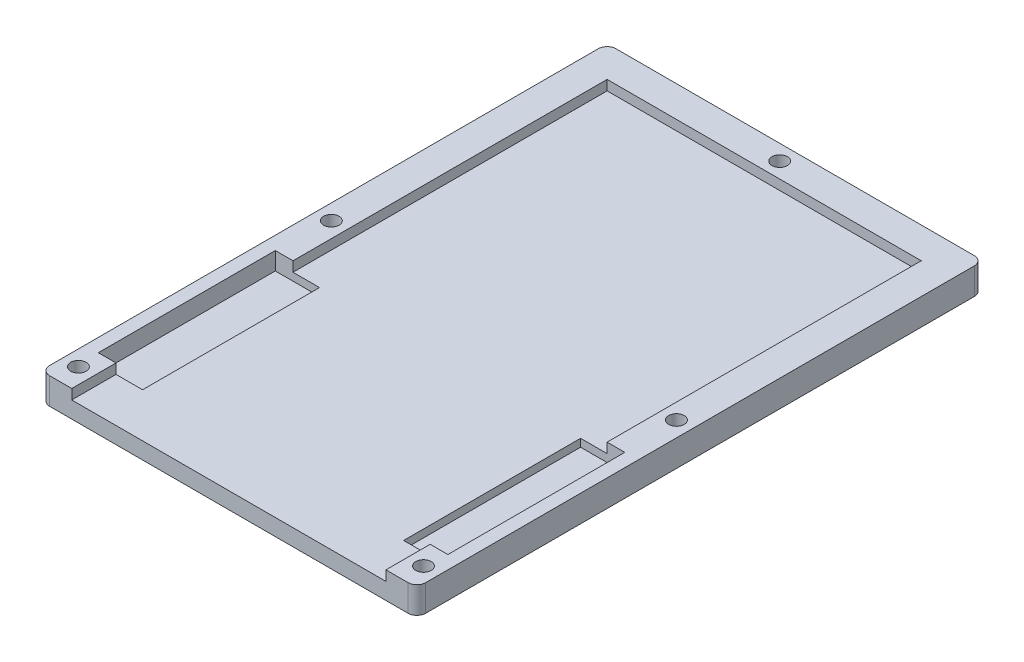
ISO-10303-21;
HEADER;
FILE_DESCRIPTION(('STEP AP214'),'2;1');
FILE_NAME('part.step','',(''),(''),'','','');
FILE_SCHEMA(('AUTOMOTIVE_DESIGN { 1 0 10303 214 1 1 1 1 }'));
ENDSEC;
DATA;
#1=APPLICATION_CONTEXT('core data for automotive mechanical design processes');
#2=APPLICATION_PROTOCOL_DEFINITION('international standard','automotive_design',2000,#1);
#3=PRODUCT_CONTEXT('',#1,'mechanical');
#4=PRODUCT('Part','Part','',(#3));
#5=PRODUCT_RELATED_PRODUCT_CATEGORY('part','',(#4));
#6=PRODUCT_DEFINITION_FORMATION('','',#4);
#7=PRODUCT_DEFINITION_CONTEXT('part definition',#1,'design');
#8=PRODUCT_DEFINITION('design','',#6,#7);
#9=PRODUCT_DEFINITION_SHAPE('','',#8);
#10=(LENGTH_UNIT() NAMED_UNIT(*) SI_UNIT(.MILLI.,.METRE.));
#11=(NAMED_UNIT(*) PLANE_ANGLE_UNIT() SI_UNIT($,.RADIAN.));
#12=(NAMED_UNIT(*) SI_UNIT($,.STERADIAN.) SOLID_ANGLE_UNIT());
#13=UNCERTAINTY_MEASURE_WITH_UNIT(LENGTH_MEASURE(1.E-05),#10,'distance_accuracy_value','');
#14=(GEOMETRIC_REPRESENTATION_CONTEXT(3) GLOBAL_UNCERTAINTY_ASSIGNED_CONTEXT((#13)) GLOBAL_UNIT_ASSIGNED_CONTEXT((#10,
#11,#12)) REPRESENTATION_CONTEXT('',''));
#15=CARTESIAN_POINT('',(0.,0.,0.));
#16=DIRECTION('',(0.,0.,1.));
#17=DIRECTION('',(1.,0.,0.));
#18=AXIS2_PLACEMENT_3D('',#15,#16,#17);
#19=CARTESIAN_POINT('',(-40.5,6.,62.));
#20=DIRECTION('',(0.,1.,0.));
#21=DIRECTION('',(0.,0.,1.));
#22=AXIS2_PLACEMENT_3D('',#19,#20,#21);
#23=CYLINDRICAL_SURFACE('',#22,2.);
#24=DIRECTION('',(0.,1.,0.));
#25=VECTOR('',#24,1.);
#26=CARTESIAN_POINT('',(-42.5,6.,62.));
#27=LINE('',#26,#25);
#28=CARTESIAN_POINT('',(-42.5,0.,62.));
#29=VERTEX_POINT('',#28);
#30=CARTESIAN_POINT('',(-42.5,6.,62.));
#31=VERTEX_POINT('',#30);
#32=EDGE_CURVE('E425',#29,#31,#27,.T.);
#33=ORIENTED_EDGE('',*,*,#32,.F.);
#34=CARTESIAN_POINT('',(-40.5,0.,62.));
#35=DIRECTION('',(0.,1.,0.));
#36=DIRECTION('',(0.,0.,1.));
#37=AXIS2_PLACEMENT_3D('',#34,#35,#36);
#38=CIRCLE('',#37,2.);
#39=CARTESIAN_POINT('',(-40.5,0.,64.));
#40=VERTEX_POINT('',#39);
#41=EDGE_CURVE('E42',#40,#29,#38,.F.);
#42=ORIENTED_EDGE('',*,*,#41,.F.);
#43=DIRECTION('',(0.,1.,0.));
#44=VECTOR('',#43,1.);
#45=CARTESIAN_POINT('',(-40.5,6.,64.));
#46=LINE('',#45,#44);
#47=CARTESIAN_POINT('',(-40.5,6.,64.));
#48=VERTEX_POINT('',#47);
#49=EDGE_CURVE('E428',#48,#40,#46,.F.);
#50=ORIENTED_EDGE('',*,*,#49,.F.);
#51=CARTESIAN_POINT('',(-40.5,6.,62.));
#52=DIRECTION('',(0.,1.,0.));
#53=DIRECTION('',(0.,0.,1.));
#54=AXIS2_PLACEMENT_3D('',#51,#52,#53);
#55=CIRCLE('',#54,2.);
#56=EDGE_CURVE('E11',#31,#48,#55,.T.);
#57=ORIENTED_EDGE('',*,*,#56,.F.);
#58=EDGE_LOOP('',(#33,#42,#50,#57));
#59=FACE_BOUND('',#58,.T.);
#60=ADVANCED_FACE('F35',(#59),#23,.T.);
#61=CARTESIAN_POINT('',(-40.5,6.,-62.));
#62=DIRECTION('',(0.,1.,0.));
#63=DIRECTION('',(0.,0.,1.));
#64=AXIS2_PLACEMENT_3D('',#61,#62,#63);
#65=CYLINDRICAL_SURFACE('',#64,2.);
#66=DIRECTION('',(0.,1.,0.));
#67=VECTOR('',#66,1.);
#68=CARTESIAN_POINT('',(-40.5,6.,-64.));
#69=LINE('',#68,#67);
#70=CARTESIAN_POINT('',(-40.5,0.,-64.));
#71=VERTEX_POINT('',#70);
#72=CARTESIAN_POINT('',(-40.5,6.,-64.));
#73=VERTEX_POINT('',#72);
#74=EDGE_CURVE('E415',#71,#73,#69,.T.);
#75=ORIENTED_EDGE('',*,*,#74,.F.);
#76=CARTESIAN_POINT('',(-40.5,0.,-62.));
#77=DIRECTION('',(0.,1.,0.));
#78=DIRECTION('',(0.,0.,1.));
#79=AXIS2_PLACEMENT_3D('',#76,#77,#78);
#80=CIRCLE('',#79,2.);
#81=CARTESIAN_POINT('',(-42.5,0.,-62.));
#82=VERTEX_POINT('',#81);
#83=EDGE_CURVE('E421',#82,#71,#80,.F.);
#84=ORIENTED_EDGE('',*,*,#83,.F.);
#85=DIRECTION('',(0.,1.,0.));
#86=VECTOR('',#85,1.);
#87=CARTESIAN_POINT('',(-42.5,6.,-62.));
#88=LINE('',#87,#86);
#89=CARTESIAN_POINT('',(-42.5,6.,-62.));
#90=VERTEX_POINT('',#89);
#91=EDGE_CURVE('E418',#90,#82,#88,.F.);
#92=ORIENTED_EDGE('',*,*,#91,.F.);
#93=CARTESIAN_POINT('',(-40.5,6.,-62.));
#94=DIRECTION('',(0.,1.,0.));
#95=DIRECTION('',(0.,0.,1.));
#96=AXIS2_PLACEMENT_3D('',#93,#94,#95);
#97=CIRCLE('',#96,2.);
#98=EDGE_CURVE('E423',#73,#90,#97,.T.);
#99=ORIENTED_EDGE('',*,*,#98,.F.);
#100=EDGE_LOOP('',(#75,#84,#92,#99));
#101=FACE_BOUND('',#100,.T.);
#102=ADVANCED_FACE('F439',(#101),#65,.T.);
#103=CARTESIAN_POINT('',(40.5,6.,-62.));
#104=DIRECTION('',(0.,1.,0.));
#105=DIRECTION('',(0.,0.,1.));
#106=AXIS2_PLACEMENT_3D('',#103,#104,#105);
#107=CYLINDRICAL_SURFACE('',#106,2.);
#108=DIRECTION('',(0.,1.,0.));
#109=VECTOR('',#108,1.);
#110=CARTESIAN_POINT('',(42.5,6.,-62.));
#111=LINE('',#110,#109);
#112=CARTESIAN_POINT('',(42.5,0.,-62.));
#113=VERTEX_POINT('',#112);
#114=CARTESIAN_POINT('',(42.5,6.,-62.));
#115=VERTEX_POINT('',#114);
#116=EDGE_CURVE('E405',#113,#115,#111,.T.);
#117=ORIENTED_EDGE('',*,*,#116,.F.);
#118=CARTESIAN_POINT('',(40.5,0.,-62.));
#119=DIRECTION('',(0.,1.,0.));
#120=DIRECTION('',(0.,0.,1.));
#121=AXIS2_PLACEMENT_3D('',#118,#119,#120);
#122=CIRCLE('',#121,2.);
#123=CARTESIAN_POINT('',(40.5,0.,-64.));
#124=VERTEX_POINT('',#123);
#125=EDGE_CURVE('E411',#124,#113,#122,.F.);
#126=ORIENTED_EDGE('',*,*,#125,.F.);
#127=DIRECTION('',(0.,1.,0.));
#128=VECTOR('',#127,1.);
#129=CARTESIAN_POINT('',(40.5,6.,-64.));
#130=LINE('',#129,#128);
#131=CARTESIAN_POINT('',(40.5,6.,-64.));
#132=VERTEX_POINT('',#131);
#133=EDGE_CURVE('E408',#132,#124,#130,.F.);
#134=ORIENTED_EDGE('',*,*,#133,.F.);
#135=CARTESIAN_POINT('',(40.5,6.,-62.));
#136=DIRECTION('',(0.,1.,0.));
#137=DIRECTION('',(0.,0.,1.));
#138=AXIS2_PLACEMENT_3D('',#135,#136,#137);
#139=CIRCLE('',#138,2.);
#140=EDGE_CURVE('E413',#115,#132,#139,.T.);
#141=ORIENTED_EDGE('',*,*,#140,.F.);
#142=EDGE_LOOP('',(#117,#126,#134,#141));
#143=FACE_BOUND('',#142,.T.);
#144=ADVANCED_FACE('F448',(#143),#107,.T.);
#145=CARTESIAN_POINT('',(40.5,6.,62.));
#146=DIRECTION('',(0.,1.,0.));
#147=DIRECTION('',(0.,0.,1.));
#148=AXIS2_PLACEMENT_3D('',#145,#146,#147);
#149=CYLINDRICAL_SURFACE('',#148,2.);
#150=DIRECTION('',(0.,1.,0.));
#151=VECTOR('',#150,1.);
#152=CARTESIAN_POINT('',(40.5,6.,64.));
#153=LINE('',#152,#151);
#154=CARTESIAN_POINT('',(40.5,0.,64.));
#155=VERTEX_POINT('',#154);
#156=CARTESIAN_POINT('',(40.5,6.,64.));
#157=VERTEX_POINT('',#156);
#158=EDGE_CURVE('E394',#155,#157,#153,.T.);
#159=ORIENTED_EDGE('',*,*,#158,.F.);
#160=CARTESIAN_POINT('',(40.5,0.,62.));
#161=DIRECTION('',(0.,1.,0.));
#162=DIRECTION('',(0.,0.,1.));
#163=AXIS2_PLACEMENT_3D('',#160,#161,#162);
#164=CIRCLE('',#163,2.);
#165=CARTESIAN_POINT('',(42.5,0.,62.));
#166=VERTEX_POINT('',#165);
#167=EDGE_CURVE('E400',#166,#155,#164,.F.);
#168=ORIENTED_EDGE('',*,*,#167,.F.);
#169=DIRECTION('',(0.,1.,0.));
#170=VECTOR('',#169,1.);
#171=CARTESIAN_POINT('',(42.5,6.,62.));
#172=LINE('',#171,#170);
#173=CARTESIAN_POINT('',(42.5,6.,62.));
#174=VERTEX_POINT('',#173);
#175=EDGE_CURVE('E397',#174,#166,#172,.F.);
#176=ORIENTED_EDGE('',*,*,#175,.F.);
#177=CARTESIAN_POINT('',(40.5,6.,62.));
#178=DIRECTION('',(0.,1.,0.));
#179=DIRECTION('',(0.,0.,1.));
#180=AXIS2_PLACEMENT_3D('',#177,#178,#179);
#181=CIRCLE('',#180,2.);
#182=EDGE_CURVE('E403',#157,#174,#181,.T.);
#183=ORIENTED_EDGE('',*,*,#182,.F.);
#184=EDGE_LOOP('',(#159,#168,#176,#183));
#185=FACE_BOUND('',#184,.T.);
#186=ADVANCED_FACE('F455',(#185),#149,.T.);
#187=CARTESIAN_POINT('',(-35.5,3.75,64.));
#188=DIRECTION('',(-1.,0.,0.));
#189=DIRECTION('',(0.,0.,1.));
#190=AXIS2_PLACEMENT_3D('',#187,#188,#189);
#191=PLANE('',#190);
#192=DIRECTION('',(0.,0.,1.));
#193=VECTOR('',#192,1.);
#194=CARTESIAN_POINT('',(-35.5,6.,64.));
#195=LINE('',#194,#193);
#196=CARTESIAN_POINT('',(-35.5,6.,-57.));
#197=VERTEX_POINT('',#196);
#198=CARTESIAN_POINT('',(-35.5,6.,14.));
#199=VERTEX_POINT('',#198);
#200=EDGE_CURVE('E290',#197,#199,#195,.T.);
#201=ORIENTED_EDGE('',*,*,#200,.T.);
#202=DIRECTION('',(0.,-1.,0.));
#203=VECTOR('',#202,1.);
#204=CARTESIAN_POINT('',(-35.5,3.75,14.));
#205=LINE('',#204,#203);
#206=CARTESIAN_POINT('',(-35.5,3.75,14.));
#207=VERTEX_POINT('',#206);
#208=EDGE_CURVE('E235',#199,#207,#205,.T.);
#209=ORIENTED_EDGE('',*,*,#208,.T.);
#210=DIRECTION('',(0.,0.,1.));
#211=VECTOR('',#210,1.);
#212=CARTESIAN_POINT('',(-35.5,3.75,64.));
#213=LINE('',#212,#211);
#214=CARTESIAN_POINT('',(-35.5,3.75,-57.));
#215=VERTEX_POINT('',#214);
#216=EDGE_CURVE('E275',#215,#207,#213,.T.);
#217=ORIENTED_EDGE('',*,*,#216,.F.);
#218=DIRECTION('',(0.,1.,0.));
#219=VECTOR('',#218,1.);
#220=CARTESIAN_POINT('',(-35.5,3.75,-57.));
#221=LINE('',#220,#219);
#222=EDGE_CURVE('E300',#215,#197,#221,.T.);
#223=ORIENTED_EDGE('',*,*,#222,.T.);
#224=EDGE_LOOP('',(#201,#209,#217,#223));
#225=FACE_BOUND('',#224,.T.);
#226=ADVANCED_FACE('F485',(#225),#191,.F.);
#227=CARTESIAN_POINT('',(35.5,3.75,64.));
#228=DIRECTION('',(1.,0.,0.));
#229=DIRECTION('',(0.,0.,-1.));
#230=AXIS2_PLACEMENT_3D('',#227,#228,#229);
#231=PLANE('',#230);
#232=DIRECTION('',(0.,0.,-1.));
#233=VECTOR('',#232,1.);
#234=CARTESIAN_POINT('',(35.5,6.,64.));
#235=LINE('',#234,#233);
#236=CARTESIAN_POINT('',(35.5,6.,64.));
#237=VERTEX_POINT('',#236);
#238=CARTESIAN_POINT('',(35.5,6.,54.));
#239=VERTEX_POINT('',#238);
#240=EDGE_CURVE('E294',#237,#239,#235,.T.);
#241=ORIENTED_EDGE('',*,*,#240,.T.);
#242=DIRECTION('',(0.,-1.,0.));
#243=VECTOR('',#242,1.);
#244=CARTESIAN_POINT('',(35.5,3.75,54.));
#245=LINE('',#244,#243);
#246=CARTESIAN_POINT('',(35.5,3.75,54.));
#247=VERTEX_POINT('',#246);
#248=EDGE_CURVE('E271',#239,#247,#245,.T.);
#249=ORIENTED_EDGE('',*,*,#248,.T.);
#250=DIRECTION('',(0.,0.,-1.));
#251=VECTOR('',#250,1.);
#252=CARTESIAN_POINT('',(35.5,3.75,64.));
#253=LINE('',#252,#251);
#254=CARTESIAN_POINT('',(35.5,3.75,64.));
#255=VERTEX_POINT('',#254);
#256=EDGE_CURVE('E283',#255,#247,#253,.T.);
#257=ORIENTED_EDGE('',*,*,#256,.F.);
#258=DIRECTION('',(0.,1.,0.));
#259=VECTOR('',#258,1.);
#260=CARTESIAN_POINT('',(35.5,3.75,64.));
#261=LINE('',#260,#259);
#262=EDGE_CURVE('E306',#255,#237,#261,.T.);
#263=ORIENTED_EDGE('',*,*,#262,.T.);
#264=EDGE_LOOP('',(#241,#249,#257,#263));
#265=FACE_BOUND('',#264,.T.);
#266=ADVANCED_FACE('F468',(#265),#231,.F.);
#267=CARTESIAN_POINT('',(-42.5,6.,64.));
#268=DIRECTION('',(1.,0.,0.));
#269=DIRECTION('',(0.,0.,-1.));
#270=AXIS2_PLACEMENT_3D('',#267,#268,#269);
#271=PLANE('',#270);
#272=DIRECTION('',(0.,0.,1.));
#273=VECTOR('',#272,1.);
#274=CARTESIAN_POINT('',(-42.5,0.,64.));
#275=LINE('',#274,#273);
#276=EDGE_CURVE('E344',#82,#29,#275,.T.);
#277=ORIENTED_EDGE('',*,*,#276,.T.);
#278=ORIENTED_EDGE('',*,*,#32,.T.);
#279=DIRECTION('',(0.,0.,1.));
#280=VECTOR('',#279,1.);
#281=CARTESIAN_POINT('',(-42.5,6.,64.));
#282=LINE('',#281,#280);
#283=EDGE_CURVE('E345',#90,#31,#282,.T.);
#284=ORIENTED_EDGE('',*,*,#283,.F.);
#285=ORIENTED_EDGE('',*,*,#91,.T.);
#286=EDGE_LOOP('',(#277,#278,#284,#285));
#287=FACE_BOUND('',#286,.T.);
#288=ADVANCED_FACE('F435',(#287),#271,.F.);
#289=CARTESIAN_POINT('',(42.5,6.,64.));
#290=DIRECTION('',(0.,0.,-1.));
#291=DIRECTION('',(-1.,0.,0.));
#292=AXIS2_PLACEMENT_3D('',#289,#290,#291);
#293=PLANE('',#292);
#294=DIRECTION('',(1.,0.,0.));
#295=VECTOR('',#294,1.);
#296=CARTESIAN_POINT('',(42.5,6.,64.));
#297=LINE('',#296,#295);
#298=CARTESIAN_POINT('',(-35.5,6.,64.));
#299=VERTEX_POINT('',#298);
#300=EDGE_CURVE('E349',#48,#299,#297,.T.);
#301=ORIENTED_EDGE('',*,*,#300,.F.);
#302=ORIENTED_EDGE('',*,*,#49,.T.);
#303=DIRECTION('',(1.,0.,0.));
#304=VECTOR('',#303,1.);
#305=CARTESIAN_POINT('',(42.5,0.,64.));
#306=LINE('',#305,#304);
#307=EDGE_CURVE('E360',#40,#155,#306,.T.);
#308=ORIENTED_EDGE('',*,*,#307,.T.);
#309=ORIENTED_EDGE('',*,*,#158,.T.);
#310=EDGE_CURVE('E347',#237,#157,#297,.T.);
#311=ORIENTED_EDGE('',*,*,#310,.F.);
#312=ORIENTED_EDGE('',*,*,#262,.F.);
#313=DIRECTION('',(1.,0.,0.));
#314=VECTOR('',#313,1.);
#315=CARTESIAN_POINT('',(-35.5,3.75,64.));
#316=LINE('',#315,#314);
#317=CARTESIAN_POINT('',(-35.5,3.75,64.));
#318=VERTEX_POINT('',#317);
#319=EDGE_CURVE('E278',#318,#255,#316,.T.);
#320=ORIENTED_EDGE('',*,*,#319,.F.);
#321=DIRECTION('',(0.,1.,0.));
#322=VECTOR('',#321,1.);
#323=CARTESIAN_POINT('',(-35.5,3.75,64.));
#324=LINE('',#323,#322);
#325=EDGE_CURVE('E289',#318,#299,#324,.T.);
#326=ORIENTED_EDGE('',*,*,#325,.T.);
#327=EDGE_LOOP('',(#301,#302,#308,#309,#311,#312,#320,#326));
#328=FACE_BOUND('',#327,.T.);
#329=ADVANCED_FACE('F460',(#328),#293,.F.);
#330=CARTESIAN_POINT('',(42.5,6.,64.));
#331=DIRECTION('',(-1.,0.,0.));
#332=DIRECTION('',(0.,0.,1.));
#333=AXIS2_PLACEMENT_3D('',#330,#331,#332);
#334=PLANE('',#333);
#335=DIRECTION('',(0.,0.,-1.));
#336=VECTOR('',#335,1.);
#337=CARTESIAN_POINT('',(42.5,0.,64.));
#338=LINE('',#337,#336);
#339=EDGE_CURVE('E362',#166,#113,#338,.T.);
#340=ORIENTED_EDGE('',*,*,#339,.T.);
#341=ORIENTED_EDGE('',*,*,#116,.T.);
#342=DIRECTION('',(0.,0.,-1.));
#343=VECTOR('',#342,1.);
#344=CARTESIAN_POINT('',(42.5,6.,64.));
#345=LINE('',#344,#343);
#346=EDGE_CURVE('E351',#174,#115,#345,.T.);
#347=ORIENTED_EDGE('',*,*,#346,.F.);
#348=ORIENTED_EDGE('',*,*,#175,.T.);
#349=EDGE_LOOP('',(#340,#341,#347,#348));
#350=FACE_BOUND('',#349,.T.);
#351=ADVANCED_FACE('F451',(#350),#334,.F.);
#352=CARTESIAN_POINT('',(42.5,6.,-64.));
#353=DIRECTION('',(0.,0.,1.));
#354=DIRECTION('',(1.,0.,0.));
#355=AXIS2_PLACEMENT_3D('',#352,#353,#354);
#356=PLANE('',#355);
#357=DIRECTION('',(-1.,0.,0.));
#358=VECTOR('',#357,1.);
#359=CARTESIAN_POINT('',(42.5,0.,-64.));
#360=LINE('',#359,#358);
#361=EDGE_CURVE('E348',#124,#71,#360,.T.);
#362=ORIENTED_EDGE('',*,*,#361,.T.);
#363=ORIENTED_EDGE('',*,*,#74,.T.);
#364=DIRECTION('',(-1.,0.,0.));
#365=VECTOR('',#364,1.);
#366=CARTESIAN_POINT('',(42.5,6.,-64.));
#367=LINE('',#366,#365);
#368=EDGE_CURVE('E354',#132,#73,#367,.T.);
#369=ORIENTED_EDGE('',*,*,#368,.F.);
#370=ORIENTED_EDGE('',*,*,#133,.T.);
#371=EDGE_LOOP('',(#362,#363,#369,#370));
#372=FACE_BOUND('',#371,.T.);
#373=ADVANCED_FACE('F444',(#372),#356,.F.);
#374=CARTESIAN_POINT('',(0.,6.,0.));
#375=DIRECTION('',(0.,1.,0.));
#376=DIRECTION('',(0.,0.,1.));
#377=AXIS2_PLACEMENT_3D('',#374,#375,#376);
#378=PLANE('',#377);
#379=ORIENTED_EDGE('',*,*,#283,.T.);
#380=ORIENTED_EDGE('',*,*,#56,.T.);
#381=ORIENTED_EDGE('',*,*,#300,.T.);
#382=CARTESIAN_POINT('',(-35.5,6.,54.));
#383=VERTEX_POINT('',#382);
#384=EDGE_CURVE('E274',#383,#299,#195,.T.);
#385=ORIENTED_EDGE('',*,*,#384,.F.);
#386=DIRECTION('',(1.,0.,0.));
#387=VECTOR('',#386,1.);
#388=CARTESIAN_POINT('',(-39.5,6.,54.));
#389=LINE('',#388,#387);
#390=CARTESIAN_POINT('',(-39.5,6.,54.));
#391=VERTEX_POINT('',#390);
#392=EDGE_CURVE('E219',#391,#383,#389,.T.);
#393=ORIENTED_EDGE('',*,*,#392,.F.);
#394=DIRECTION('',(0.,0.,1.));
#395=VECTOR('',#394,1.);
#396=CARTESIAN_POINT('',(-39.5,6.,54.));
#397=LINE('',#396,#395);
#398=CARTESIAN_POINT('',(-39.5,6.,14.));
#399=VERTEX_POINT('',#398);
#400=EDGE_CURVE('E200',#399,#391,#397,.T.);
#401=ORIENTED_EDGE('',*,*,#400,.F.);
#402=DIRECTION('',(-1.,0.,0.));
#403=VECTOR('',#402,1.);
#404=CARTESIAN_POINT('',(-39.5,6.,14.));
#405=LINE('',#404,#403);
#406=EDGE_CURVE('E217',#199,#399,#405,.T.);
#407=ORIENTED_EDGE('',*,*,#406,.F.);
#408=ORIENTED_EDGE('',*,*,#200,.F.);
#409=DIRECTION('',(-1.,0.,0.));
#410=VECTOR('',#409,1.);
#411=CARTESIAN_POINT('',(-35.5,6.,-57.));
#412=LINE('',#411,#410);
#413=CARTESIAN_POINT('',(35.5,6.,-57.));
#414=VERTEX_POINT('',#413);
#415=EDGE_CURVE('E297',#414,#197,#412,.T.);
#416=ORIENTED_EDGE('',*,*,#415,.F.);
#417=CARTESIAN_POINT('',(35.5,6.,14.));
#418=VERTEX_POINT('',#417);
#419=EDGE_CURVE('E293',#418,#414,#235,.T.);
#420=ORIENTED_EDGE('',*,*,#419,.F.);
#421=DIRECTION('',(-1.,0.,0.));
#422=VECTOR('',#421,1.);
#423=CARTESIAN_POINT('',(39.5,6.,14.));
#424=LINE('',#423,#422);
#425=CARTESIAN_POINT('',(39.5,6.,14.));
#426=VERTEX_POINT('',#425);
#427=EDGE_CURVE('E255',#426,#418,#424,.T.);
#428=ORIENTED_EDGE('',*,*,#427,.F.);
#429=DIRECTION('',(0.,0.,-1.));
#430=VECTOR('',#429,1.);
#431=CARTESIAN_POINT('',(39.5,6.,54.));
#432=LINE('',#431,#430);
#433=CARTESIAN_POINT('',(39.5,6.,54.));
#434=VERTEX_POINT('',#433);
#435=EDGE_CURVE('E238',#434,#426,#432,.T.);
#436=ORIENTED_EDGE('',*,*,#435,.F.);
#437=DIRECTION('',(1.,0.,0.));
#438=VECTOR('',#437,1.);
#439=CARTESIAN_POINT('',(39.5,6.,54.));
#440=LINE('',#439,#438);
#441=EDGE_CURVE('E243',#239,#434,#440,.T.);
#442=ORIENTED_EDGE('',*,*,#441,.F.);
#443=ORIENTED_EDGE('',*,*,#240,.F.);
#444=ORIENTED_EDGE('',*,*,#310,.T.);
#445=ORIENTED_EDGE('',*,*,#182,.T.);
#446=ORIENTED_EDGE('',*,*,#346,.T.);
#447=ORIENTED_EDGE('',*,*,#140,.T.);
#448=ORIENTED_EDGE('',*,*,#368,.T.);
#449=ORIENTED_EDGE('',*,*,#98,.T.);
#450=EDGE_LOOP('',(#379,#380,#381,#385,#393,#401,#407,#408,#416,#420,#428,#436,#442,#443,#444,
#445,#446,#447,#448,#449));
#451=FACE_BOUND('',#450,.T.);
#452=CARTESIAN_POINT('',(0.,6.,-60.5));
#453=DIRECTION('',(0.,1.,0.));
#454=DIRECTION('',(0.,0.,1.));
#455=AXIS2_PLACEMENT_3D('',#452,#453,#454);
#456=CIRCLE('',#455,1.75);
#457=CARTESIAN_POINT('',(0.,6.,-58.75));
#458=VERTEX_POINT('',#457);
#459=EDGE_CURVE('E329',#458,#458,#456,.T.);
#460=ORIENTED_EDGE('',*,*,#459,.F.);
#461=EDGE_LOOP('',(#460));
#462=FACE_BOUND('',#461,.T.);
#463=CARTESIAN_POINT('',(39.,6.,1.83000000000001));
#464=DIRECTION('',(0.,1.,0.));
#465=DIRECTION('',(0.,0.,1.));
#466=AXIS2_PLACEMENT_3D('',#463,#464,#465);
#467=CIRCLE('',#466,1.75);
#468=CARTESIAN_POINT('',(39.,6.,3.58000000000001));
#469=VERTEX_POINT('',#468);
#470=EDGE_CURVE('E332',#469,#469,#467,.T.);
#471=ORIENTED_EDGE('',*,*,#470,.F.);
#472=EDGE_LOOP('',(#471));
#473=FACE_BOUND('',#472,.T.);
#474=CARTESIAN_POINT('',(-39.,6.,1.83000000000001));
#475=DIRECTION('',(0.,1.,0.));
#476=DIRECTION('',(0.,0.,1.));
#477=AXIS2_PLACEMENT_3D('',#474,#475,#476);
#478=CIRCLE('',#477,1.75);
#479=CARTESIAN_POINT('',(-39.,6.,3.58000000000001));
#480=VERTEX_POINT('',#479);
#481=EDGE_CURVE('E335',#480,#480,#478,.T.);
#482=ORIENTED_EDGE('',*,*,#481,.F.);
#483=EDGE_LOOP('',(#482));
#484=FACE_BOUND('',#483,.T.);
#485=CARTESIAN_POINT('',(-39.,6.,59.));
#486=DIRECTION('',(0.,1.,0.));
#487=DIRECTION('',(0.,0.,1.));
#488=AXIS2_PLACEMENT_3D('',#485,#486,#487);
#489=CIRCLE('',#488,1.75);
#490=CARTESIAN_POINT('',(-39.,6.,60.75));
#491=VERTEX_POINT('',#490);
#492=EDGE_CURVE('E338',#491,#491,#489,.T.);
#493=ORIENTED_EDGE('',*,*,#492,.F.);
#494=EDGE_LOOP('',(#493));
#495=FACE_BOUND('',#494,.T.);
#496=CARTESIAN_POINT('',(39.,6.,59.));
#497=DIRECTION('',(0.,1.,0.));
#498=DIRECTION('',(0.,0.,1.));
#499=AXIS2_PLACEMENT_3D('',#496,#497,#498);
#500=CIRCLE('',#499,1.75);
#501=CARTESIAN_POINT('',(39.,6.,60.75));
#502=VERTEX_POINT('',#501);
#503=EDGE_CURVE('E341',#502,#502,#500,.T.);
#504=ORIENTED_EDGE('',*,*,#503,.F.);
#505=EDGE_LOOP('',(#504));
#506=FACE_BOUND('',#505,.T.);
#507=ADVANCED_FACE('F463',(#451,#462,#473,#484,#495,#506),#378,.T.);
#508=CARTESIAN_POINT('',(0.,0.,0.));
#509=DIRECTION('',(0.,1.,0.));
#510=DIRECTION('',(0.,0.,1.));
#511=AXIS2_PLACEMENT_3D('',#508,#509,#510);
#512=PLANE('',#511);
#513=CARTESIAN_POINT('',(0.,0.,-60.5));
#514=DIRECTION('',(0.,-1.,0.));
#515=DIRECTION('',(0.,0.,-1.));
#516=AXIS2_PLACEMENT_3D('',#513,#514,#515);
#517=CIRCLE('',#516,2.5);
#518=CARTESIAN_POINT('',(0.,0.,-63.));
#519=VERTEX_POINT('',#518);
#520=EDGE_CURVE('E302',#519,#519,#517,.T.);
#521=ORIENTED_EDGE('',*,*,#520,.F.);
#522=EDGE_LOOP('',(#521));
#523=FACE_BOUND('',#522,.T.);
#524=CARTESIAN_POINT('',(39.,0.,1.83000000000001));
#525=DIRECTION('',(0.,-1.,0.));
#526=DIRECTION('',(0.,0.,-1.));
#527=AXIS2_PLACEMENT_3D('',#524,#525,#526);
#528=CIRCLE('',#527,2.5);
#529=CARTESIAN_POINT('',(39.,0.,-0.669999999999997));
#530=VERTEX_POINT('',#529);
#531=EDGE_CURVE('E313',#530,#530,#528,.T.);
#532=ORIENTED_EDGE('',*,*,#531,.F.);
#533=EDGE_LOOP('',(#532));
#534=FACE_BOUND('',#533,.T.);
#535=CARTESIAN_POINT('',(-39.,0.,1.83000000000001));
#536=DIRECTION('',(0.,-1.,0.));
#537=DIRECTION('',(0.,0.,-1.));
#538=AXIS2_PLACEMENT_3D('',#535,#536,#537);
#539=CIRCLE('',#538,2.5);
#540=CARTESIAN_POINT('',(-39.,0.,-0.669999999999997));
#541=VERTEX_POINT('',#540);
#542=EDGE_CURVE('E317',#541,#541,#539,.T.);
#543=ORIENTED_EDGE('',*,*,#542,.F.);
#544=EDGE_LOOP('',(#543));
#545=FACE_BOUND('',#544,.T.);
#546=CARTESIAN_POINT('',(-39.,0.,59.));
#547=DIRECTION('',(0.,-1.,0.));
#548=DIRECTION('',(0.,0.,-1.));
#549=AXIS2_PLACEMENT_3D('',#546,#547,#548);
#550=CIRCLE('',#549,2.5);
#551=CARTESIAN_POINT('',(-39.,0.,56.5));
#552=VERTEX_POINT('',#551);
#553=EDGE_CURVE('E321',#552,#552,#550,.T.);
#554=ORIENTED_EDGE('',*,*,#553,.F.);
#555=EDGE_LOOP('',(#554));
#556=FACE_BOUND('',#555,.T.);
#557=CARTESIAN_POINT('',(39.,0.,59.));
#558=DIRECTION('',(0.,-1.,0.));
#559=DIRECTION('',(0.,0.,-1.));
#560=AXIS2_PLACEMENT_3D('',#557,#558,#559);
#561=CIRCLE('',#560,2.5);
#562=CARTESIAN_POINT('',(39.,0.,56.5));
#563=VERTEX_POINT('',#562);
#564=EDGE_CURVE('E325',#563,#563,#561,.T.);
#565=ORIENTED_EDGE('',*,*,#564,.F.);
#566=EDGE_LOOP('',(#565));
#567=FACE_BOUND('',#566,.T.);
#568=ORIENTED_EDGE('',*,*,#307,.F.);
#569=ORIENTED_EDGE('',*,*,#41,.T.);
#570=ORIENTED_EDGE('',*,*,#276,.F.);
#571=ORIENTED_EDGE('',*,*,#83,.T.);
#572=ORIENTED_EDGE('',*,*,#361,.F.);
#573=ORIENTED_EDGE('',*,*,#125,.T.);
#574=ORIENTED_EDGE('',*,*,#339,.F.);
#575=ORIENTED_EDGE('',*,*,#167,.T.);
#576=EDGE_LOOP('',(#568,#569,#570,#571,#572,#573,#574,#575));
#577=FACE_BOUND('',#576,.T.);
#578=ADVANCED_FACE('F432',(#523,#534,#545,#556,#567,#577),#512,.F.);
#579=CARTESIAN_POINT('',(39.,10.,59.));
#580=DIRECTION('',(0.,-1.,0.));
#581=DIRECTION('',(0.,0.,-1.));
#582=AXIS2_PLACEMENT_3D('',#579,#580,#581);
#583=CYLINDRICAL_SURFACE('',#582,1.75);
#584=CARTESIAN_POINT('',(39.,0.749999999999996,59.));
#585=DIRECTION('',(0.,-1.,0.));
#586=DIRECTION('',(0.,0.,-1.));
#587=AXIS2_PLACEMENT_3D('',#584,#585,#586);
#588=CIRCLE('',#587,1.75);
#589=CARTESIAN_POINT('',(39.,0.749999999999996,57.25));
#590=VERTEX_POINT('',#589);
#591=EDGE_CURVE('E328',#590,#590,#588,.T.);
#592=ORIENTED_EDGE('',*,*,#591,.T.);
#593=EDGE_LOOP('',(#592));
#594=FACE_BOUND('',#593,.T.);
#595=ORIENTED_EDGE('',*,*,#503,.T.);
#596=EDGE_LOOP('',(#595));
#597=FACE_BOUND('',#596,.T.);
#598=ADVANCED_FACE('F542',(#594,#597),#583,.F.);
#599=CARTESIAN_POINT('',(-39.,10.,59.));
#600=DIRECTION('',(0.,-1.,0.));
#601=DIRECTION('',(0.,0.,-1.));
#602=AXIS2_PLACEMENT_3D('',#599,#600,#601);
#603=CYLINDRICAL_SURFACE('',#602,1.75);
#604=CARTESIAN_POINT('',(-39.,0.749999999999996,59.));
#605=DIRECTION('',(0.,-1.,0.));
#606=DIRECTION('',(0.,0.,-1.));
#607=AXIS2_PLACEMENT_3D('',#604,#605,#606);
#608=CIRCLE('',#607,1.75);
#609=CARTESIAN_POINT('',(-39.,0.749999999999996,57.25));
#610=VERTEX_POINT('',#609);
#611=EDGE_CURVE('E324',#610,#610,#608,.T.);
#612=ORIENTED_EDGE('',*,*,#611,.T.);
#613=EDGE_LOOP('',(#612));
#614=FACE_BOUND('',#613,.T.);
#615=ORIENTED_EDGE('',*,*,#492,.T.);
#616=EDGE_LOOP('',(#615));
#617=FACE_BOUND('',#616,.T.);
#618=ADVANCED_FACE('F548',(#614,#617),#603,.F.);
#619=CARTESIAN_POINT('',(-39.,10.,1.83000000000001));
#620=DIRECTION('',(0.,-1.,0.));
#621=DIRECTION('',(0.,0.,-1.));
#622=AXIS2_PLACEMENT_3D('',#619,#620,#621);
#623=CYLINDRICAL_SURFACE('',#622,1.75);
#624=CARTESIAN_POINT('',(-39.,0.749999999999996,1.83000000000001));
#625=DIRECTION('',(0.,-1.,0.));
#626=DIRECTION('',(0.,0.,-1.));
#627=AXIS2_PLACEMENT_3D('',#624,#625,#626);
#628=CIRCLE('',#627,1.75);
#629=CARTESIAN_POINT('',(-39.,0.749999999999996,0.0800000000000017));
#630=VERTEX_POINT('',#629);
#631=EDGE_CURVE('E320',#630,#630,#628,.T.);
#632=ORIENTED_EDGE('',*,*,#631,.T.);
#633=EDGE_LOOP('',(#632));
#634=FACE_BOUND('',#633,.T.);
#635=ORIENTED_EDGE('',*,*,#481,.T.);
#636=EDGE_LOOP('',(#635));
#637=FACE_BOUND('',#636,.T.);
#638=ADVANCED_FACE('F552',(#634,#637),#623,.F.);
#639=CARTESIAN_POINT('',(39.,10.,1.83000000000001));
#640=DIRECTION('',(0.,-1.,0.));
#641=DIRECTION('',(0.,0.,-1.));
#642=AXIS2_PLACEMENT_3D('',#639,#640,#641);
#643=CYLINDRICAL_SURFACE('',#642,1.75);
#644=CARTESIAN_POINT('',(39.,0.749999999999996,1.83000000000001));
#645=DIRECTION('',(0.,-1.,0.));
#646=DIRECTION('',(0.,0.,-1.));
#647=AXIS2_PLACEMENT_3D('',#644,#645,#646);
#648=CIRCLE('',#647,1.75);
#649=CARTESIAN_POINT('',(39.,0.749999999999996,0.0800000000000017));
#650=VERTEX_POINT('',#649);
#651=EDGE_CURVE('E316',#650,#650,#648,.T.);
#652=ORIENTED_EDGE('',*,*,#651,.T.);
#653=EDGE_LOOP('',(#652));
#654=FACE_BOUND('',#653,.T.);
#655=ORIENTED_EDGE('',*,*,#470,.T.);
#656=EDGE_LOOP('',(#655));
#657=FACE_BOUND('',#656,.T.);
#658=ADVANCED_FACE('F556',(#654,#657),#643,.F.);
#659=CARTESIAN_POINT('',(0.,10.,-60.5));
#660=DIRECTION('',(0.,-1.,0.));
#661=DIRECTION('',(0.,0.,-1.));
#662=AXIS2_PLACEMENT_3D('',#659,#660,#661);
#663=CYLINDRICAL_SURFACE('',#662,1.75);
#664=CARTESIAN_POINT('',(0.,0.749999999999997,-60.5));
#665=DIRECTION('',(0.,-1.,0.));
#666=DIRECTION('',(0.,0.,-1.));
#667=AXIS2_PLACEMENT_3D('',#664,#665,#666);
#668=CIRCLE('',#667,1.75);
#669=CARTESIAN_POINT('',(0.,0.749999999999997,-62.25));
#670=VERTEX_POINT('',#669);
#671=EDGE_CURVE('E312',#670,#670,#668,.T.);
#672=ORIENTED_EDGE('',*,*,#671,.T.);
#673=EDGE_LOOP('',(#672));
#674=FACE_BOUND('',#673,.T.);
#675=ORIENTED_EDGE('',*,*,#459,.T.);
#676=EDGE_LOOP('',(#675));
#677=FACE_BOUND('',#676,.T.);
#678=ADVANCED_FACE('F560',(#674,#677),#663,.F.);
#679=CARTESIAN_POINT('',(39.,0.,59.));
#680=DIRECTION('',(0.,-1.,0.));
#681=DIRECTION('',(0.,0.,-1.));
#682=AXIS2_PLACEMENT_3D('',#679,#680,#681);
#683=CONICAL_SURFACE('',#682,2.5,0.78539816339745);
#684=ORIENTED_EDGE('',*,*,#564,.T.);
#685=EDGE_LOOP('',(#684));
#686=FACE_BOUND('',#685,.T.);
#687=ORIENTED_EDGE('',*,*,#591,.F.);
#688=EDGE_LOOP('',(#687));
#689=FACE_BOUND('',#688,.T.);
#690=ADVANCED_FACE('F564',(#686,#689),#683,.F.);
#691=CARTESIAN_POINT('',(-39.,0.,59.));
#692=DIRECTION('',(0.,-1.,0.));
#693=DIRECTION('',(0.,0.,-1.));
#694=AXIS2_PLACEMENT_3D('',#691,#692,#693);
#695=CONICAL_SURFACE('',#694,2.5,0.78539816339745);
#696=ORIENTED_EDGE('',*,*,#553,.T.);
#697=EDGE_LOOP('',(#696));
#698=FACE_BOUND('',#697,.T.);
#699=ORIENTED_EDGE('',*,*,#611,.F.);
#700=EDGE_LOOP('',(#699));
#701=FACE_BOUND('',#700,.T.);
#702=ADVANCED_FACE('F568',(#698,#701),#695,.F.);
#703=CARTESIAN_POINT('',(-39.,0.,1.83000000000001));
#704=DIRECTION('',(0.,-1.,0.));
#705=DIRECTION('',(0.,0.,-1.));
#706=AXIS2_PLACEMENT_3D('',#703,#704,#705);
#707=CONICAL_SURFACE('',#706,2.5,0.78539816339745);
#708=ORIENTED_EDGE('',*,*,#542,.T.);
#709=EDGE_LOOP('',(#708));
#710=FACE_BOUND('',#709,.T.);
#711=ORIENTED_EDGE('',*,*,#631,.F.);
#712=EDGE_LOOP('',(#711));
#713=FACE_BOUND('',#712,.T.);
#714=ADVANCED_FACE('F572',(#710,#713),#707,.F.);
#715=CARTESIAN_POINT('',(39.,0.,1.83000000000001));
#716=DIRECTION('',(0.,-1.,0.));
#717=DIRECTION('',(0.,0.,-1.));
#718=AXIS2_PLACEMENT_3D('',#715,#716,#717);
#719=CONICAL_SURFACE('',#718,2.5,0.78539816339745);
#720=ORIENTED_EDGE('',*,*,#531,.T.);
#721=EDGE_LOOP('',(#720));
#722=FACE_BOUND('',#721,.T.);
#723=ORIENTED_EDGE('',*,*,#651,.F.);
#724=EDGE_LOOP('',(#723));
#725=FACE_BOUND('',#724,.T.);
#726=ADVANCED_FACE('F576',(#722,#725),#719,.F.);
#727=CARTESIAN_POINT('',(0.,0.,-60.5));
#728=DIRECTION('',(0.,-1.,0.));
#729=DIRECTION('',(0.,0.,-1.));
#730=AXIS2_PLACEMENT_3D('',#727,#728,#729);
#731=CONICAL_SURFACE('',#730,2.5,0.78539816339745);
#732=ORIENTED_EDGE('',*,*,#520,.T.);
#733=EDGE_LOOP('',(#732));
#734=FACE_BOUND('',#733,.T.);
#735=ORIENTED_EDGE('',*,*,#671,.F.);
#736=EDGE_LOOP('',(#735));
#737=FACE_BOUND('',#736,.T.);
#738=ADVANCED_FACE('F580',(#734,#737),#731,.F.);
#739=CARTESIAN_POINT('',(-35.5,3.75,54.));
#740=VERTEX_POINT('',#739);
#741=EDGE_CURVE('E279',#740,#318,#213,.T.);
#742=ORIENTED_EDGE('',*,*,#741,.F.);
#743=DIRECTION('',(0.,1.,0.));
#744=VECTOR('',#743,1.);
#745=CARTESIAN_POINT('',(-35.5,3.75,54.));
#746=LINE('',#745,#744);
#747=EDGE_CURVE('E228',#740,#383,#746,.T.);
#748=ORIENTED_EDGE('',*,*,#747,.T.);
#749=ORIENTED_EDGE('',*,*,#384,.T.);
#750=ORIENTED_EDGE('',*,*,#325,.F.);
#751=EDGE_LOOP('',(#742,#748,#749,#750));
#752=FACE_BOUND('',#751,.T.);
#753=ADVANCED_FACE('F476',(#752),#191,.F.);
#754=CARTESIAN_POINT('',(-35.5,3.75,-57.));
#755=DIRECTION('',(0.,0.,-1.));
#756=DIRECTION('',(-1.,0.,0.));
#757=AXIS2_PLACEMENT_3D('',#754,#755,#756);
#758=PLANE('',#757);
#759=ORIENTED_EDGE('',*,*,#415,.T.);
#760=ORIENTED_EDGE('',*,*,#222,.F.);
#761=DIRECTION('',(-1.,0.,0.));
#762=VECTOR('',#761,1.);
#763=CARTESIAN_POINT('',(-35.5,3.75,-57.));
#764=LINE('',#763,#762);
#765=CARTESIAN_POINT('',(35.5,3.75,-57.));
#766=VERTEX_POINT('',#765);
#767=EDGE_CURVE('E286',#766,#215,#764,.T.);
#768=ORIENTED_EDGE('',*,*,#767,.F.);
#769=DIRECTION('',(0.,1.,0.));
#770=VECTOR('',#769,1.);
#771=CARTESIAN_POINT('',(35.5,3.75,-57.));
#772=LINE('',#771,#770);
#773=EDGE_CURVE('E303',#766,#414,#772,.T.);
#774=ORIENTED_EDGE('',*,*,#773,.T.);
#775=EDGE_LOOP('',(#759,#760,#768,#774));
#776=FACE_BOUND('',#775,.T.);
#777=ADVANCED_FACE('F491',(#776),#758,.F.);
#778=CARTESIAN_POINT('',(35.5,3.75,14.));
#779=VERTEX_POINT('',#778);
#780=EDGE_CURVE('E282',#779,#766,#253,.T.);
#781=ORIENTED_EDGE('',*,*,#780,.F.);
#782=DIRECTION('',(0.,1.,0.));
#783=VECTOR('',#782,1.);
#784=CARTESIAN_POINT('',(35.5,3.75,14.));
#785=LINE('',#784,#783);
#786=EDGE_CURVE('E261',#779,#418,#785,.T.);
#787=ORIENTED_EDGE('',*,*,#786,.T.);
#788=ORIENTED_EDGE('',*,*,#419,.T.);
#789=ORIENTED_EDGE('',*,*,#773,.F.);
#790=EDGE_LOOP('',(#781,#787,#788,#789));
#791=FACE_BOUND('',#790,.T.);
#792=ADVANCED_FACE('F496',(#791),#231,.F.);
#793=CARTESIAN_POINT('',(0.,3.75,0.));
#794=DIRECTION('',(0.,-1.,0.));
#795=DIRECTION('',(0.,0.,-1.));
#796=AXIS2_PLACEMENT_3D('',#793,#794,#795);
#797=PLANE('',#796);
#798=ORIENTED_EDGE('',*,*,#216,.T.);
#799=DIRECTION('',(1.,0.,0.));
#800=VECTOR('',#799,1.);
#801=CARTESIAN_POINT('',(0.,3.75,14.));
#802=LINE('',#801,#800);
#803=CARTESIAN_POINT('',(-29.5,3.75,14.));
#804=VERTEX_POINT('',#803);
#805=EDGE_CURVE('E391',#207,#804,#802,.T.);
#806=ORIENTED_EDGE('',*,*,#805,.T.);
#807=DIRECTION('',(0.,0.,1.));
#808=VECTOR('',#807,1.);
#809=CARTESIAN_POINT('',(-29.5,3.75,0.));
#810=LINE('',#809,#808);
#811=CARTESIAN_POINT('',(-29.5,3.75,54.));
#812=VERTEX_POINT('',#811);
#813=EDGE_CURVE('E388',#804,#812,#810,.T.);
#814=ORIENTED_EDGE('',*,*,#813,.T.);
#815=DIRECTION('',(-1.,0.,0.));
#816=VECTOR('',#815,1.);
#817=CARTESIAN_POINT('',(0.,3.75,54.));
#818=LINE('',#817,#816);
#819=EDGE_CURVE('E385',#812,#740,#818,.T.);
#820=ORIENTED_EDGE('',*,*,#819,.T.);
#821=ORIENTED_EDGE('',*,*,#741,.T.);
#822=ORIENTED_EDGE('',*,*,#319,.T.);
#823=ORIENTED_EDGE('',*,*,#256,.T.);
#824=DIRECTION('',(-1.,0.,0.));
#825=VECTOR('',#824,1.);
#826=CARTESIAN_POINT('',(0.,3.75,54.));
#827=LINE('',#826,#825);
#828=CARTESIAN_POINT('',(29.5,3.75,54.));
#829=VERTEX_POINT('',#828);
#830=EDGE_CURVE('E382',#247,#829,#827,.T.);
#831=ORIENTED_EDGE('',*,*,#830,.T.);
#832=DIRECTION('',(0.,0.,-1.));
#833=VECTOR('',#832,1.);
#834=CARTESIAN_POINT('',(29.5,3.75,0.));
#835=LINE('',#834,#833);
#836=CARTESIAN_POINT('',(29.5,3.75,14.));
#837=VERTEX_POINT('',#836);
#838=EDGE_CURVE('E379',#829,#837,#835,.T.);
#839=ORIENTED_EDGE('',*,*,#838,.T.);
#840=DIRECTION('',(1.,0.,0.));
#841=VECTOR('',#840,1.);
#842=CARTESIAN_POINT('',(0.,3.75,14.));
#843=LINE('',#842,#841);
#844=EDGE_CURVE('E357',#837,#779,#843,.T.);
#845=ORIENTED_EDGE('',*,*,#844,.T.);
#846=ORIENTED_EDGE('',*,*,#780,.T.);
#847=ORIENTED_EDGE('',*,*,#767,.T.);
#848=EDGE_LOOP('',(#798,#806,#814,#820,#821,#822,#823,#831,#839,#845,#846,#847));
#849=FACE_BOUND('',#848,.T.);
#850=ADVANCED_FACE('F472',(#849),#797,.F.);
#851=CARTESIAN_POINT('',(39.5,2.,54.));
#852=DIRECTION('',(0.,0.,1.));
#853=DIRECTION('',(1.,0.,0.));
#854=AXIS2_PLACEMENT_3D('',#851,#852,#853);
#855=PLANE('',#854);
#856=ORIENTED_EDGE('',*,*,#441,.T.);
#857=DIRECTION('',(0.,1.,0.));
#858=VECTOR('',#857,1.);
#859=CARTESIAN_POINT('',(39.5,2.,54.));
#860=LINE('',#859,#858);
#861=CARTESIAN_POINT('',(39.5,2.,54.));
#862=VERTEX_POINT('',#861);
#863=EDGE_CURVE('E258',#862,#434,#860,.T.);
#864=ORIENTED_EDGE('',*,*,#863,.F.);
#865=DIRECTION('',(1.,0.,0.));
#866=VECTOR('',#865,1.);
#867=CARTESIAN_POINT('',(39.5,2.,54.));
#868=LINE('',#867,#866);
#869=CARTESIAN_POINT('',(29.5,2.,54.));
#870=VERTEX_POINT('',#869);
#871=EDGE_CURVE('E249',#870,#862,#868,.T.);
#872=ORIENTED_EDGE('',*,*,#871,.F.);
#873=DIRECTION('',(0.,1.,0.));
#874=VECTOR('',#873,1.);
#875=CARTESIAN_POINT('',(29.5,2.,54.));
#876=LINE('',#875,#874);
#877=EDGE_CURVE('E262',#870,#829,#876,.T.);
#878=ORIENTED_EDGE('',*,*,#877,.T.);
#879=ORIENTED_EDGE('',*,*,#830,.F.);
#880=ORIENTED_EDGE('',*,*,#248,.F.);
#881=EDGE_LOOP('',(#856,#864,#872,#878,#879,#880));
#882=FACE_BOUND('',#881,.T.);
#883=ADVANCED_FACE('F504',(#882),#855,.F.);
#884=CARTESIAN_POINT('',(29.5,2.,54.));
#885=DIRECTION('',(-1.,0.,0.));
#886=DIRECTION('',(0.,0.,1.));
#887=AXIS2_PLACEMENT_3D('',#884,#885,#886);
#888=PLANE('',#887);
#889=ORIENTED_EDGE('',*,*,#877,.F.);
#890=DIRECTION('',(0.,0.,1.));
#891=VECTOR('',#890,1.);
#892=CARTESIAN_POINT('',(29.5,2.,54.));
#893=LINE('',#892,#891);
#894=CARTESIAN_POINT('',(29.5,2.,14.));
#895=VERTEX_POINT('',#894);
#896=EDGE_CURVE('E246',#895,#870,#893,.T.);
#897=ORIENTED_EDGE('',*,*,#896,.F.);
#898=DIRECTION('',(0.,1.,0.));
#899=VECTOR('',#898,1.);
#900=CARTESIAN_POINT('',(29.5,2.,14.));
#901=LINE('',#900,#899);
#902=EDGE_CURVE('E265',#895,#837,#901,.T.);
#903=ORIENTED_EDGE('',*,*,#902,.T.);
#904=ORIENTED_EDGE('',*,*,#838,.F.);
#905=EDGE_LOOP('',(#889,#897,#903,#904));
#906=FACE_BOUND('',#905,.T.);
#907=ADVANCED_FACE('F500',(#906),#888,.F.);
#908=CARTESIAN_POINT('',(39.5,2.,14.));
#909=DIRECTION('',(0.,0.,-1.));
#910=DIRECTION('',(-1.,0.,0.));
#911=AXIS2_PLACEMENT_3D('',#908,#909,#910);
#912=PLANE('',#911);
#913=ORIENTED_EDGE('',*,*,#844,.F.);
#914=ORIENTED_EDGE('',*,*,#902,.F.);
#915=DIRECTION('',(-1.,0.,0.));
#916=VECTOR('',#915,1.);
#917=CARTESIAN_POINT('',(39.5,2.,14.));
#918=LINE('',#917,#916);
#919=CARTESIAN_POINT('',(39.5,2.,14.));
#920=VERTEX_POINT('',#919);
#921=EDGE_CURVE('E242',#920,#895,#918,.T.);
#922=ORIENTED_EDGE('',*,*,#921,.F.);
#923=DIRECTION('',(0.,1.,0.));
#924=VECTOR('',#923,1.);
#925=CARTESIAN_POINT('',(39.5,2.,14.));
#926=LINE('',#925,#924);
#927=EDGE_CURVE('E252',#920,#426,#926,.T.);
#928=ORIENTED_EDGE('',*,*,#927,.T.);
#929=ORIENTED_EDGE('',*,*,#427,.T.);
#930=ORIENTED_EDGE('',*,*,#786,.F.);
#931=EDGE_LOOP('',(#913,#914,#922,#928,#929,#930));
#932=FACE_BOUND('',#931,.T.);
#933=ADVANCED_FACE('F498',(#932),#912,.F.);
#934=CARTESIAN_POINT('',(39.5,2.,54.));
#935=DIRECTION('',(1.,0.,0.));
#936=DIRECTION('',(0.,0.,-1.));
#937=AXIS2_PLACEMENT_3D('',#934,#935,#936);
#938=PLANE('',#937);
#939=ORIENTED_EDGE('',*,*,#435,.T.);
#940=ORIENTED_EDGE('',*,*,#927,.F.);
#941=DIRECTION('',(0.,0.,-1.));
#942=VECTOR('',#941,1.);
#943=CARTESIAN_POINT('',(39.5,2.,54.));
#944=LINE('',#943,#942);
#945=EDGE_CURVE('E239',#862,#920,#944,.T.);
#946=ORIENTED_EDGE('',*,*,#945,.F.);
#947=ORIENTED_EDGE('',*,*,#863,.T.);
#948=EDGE_LOOP('',(#939,#940,#946,#947));
#949=FACE_BOUND('',#948,.T.);
#950=ADVANCED_FACE('F510',(#949),#938,.F.);
#951=CARTESIAN_POINT('',(0.,2.,0.));
#952=DIRECTION('',(0.,1.,0.));
#953=DIRECTION('',(0.,0.,1.));
#954=AXIS2_PLACEMENT_3D('',#951,#952,#953);
#955=PLANE('',#954);
#956=ORIENTED_EDGE('',*,*,#945,.T.);
#957=ORIENTED_EDGE('',*,*,#921,.T.);
#958=ORIENTED_EDGE('',*,*,#896,.T.);
#959=ORIENTED_EDGE('',*,*,#871,.T.);
#960=EDGE_LOOP('',(#956,#957,#958,#959));
#961=FACE_BOUND('',#960,.T.);
#962=ADVANCED_FACE('F507',(#961),#955,.T.);
#963=CARTESIAN_POINT('',(-39.5,2.,14.));
#964=DIRECTION('',(0.,0.,-1.));
#965=DIRECTION('',(-1.,0.,0.));
#966=AXIS2_PLACEMENT_3D('',#963,#964,#965);
#967=PLANE('',#966);
#968=ORIENTED_EDGE('',*,*,#406,.T.);
#969=DIRECTION('',(0.,1.,0.));
#970=VECTOR('',#969,1.);
#971=CARTESIAN_POINT('',(-39.5,2.,14.));
#972=LINE('',#971,#970);
#973=CARTESIAN_POINT('',(-39.5,2.,14.));
#974=VERTEX_POINT('',#973);
#975=EDGE_CURVE('E226',#974,#399,#972,.T.);
#976=ORIENTED_EDGE('',*,*,#975,.F.);
#977=DIRECTION('',(-1.,0.,0.));
#978=VECTOR('',#977,1.);
#979=CARTESIAN_POINT('',(-39.5,2.,14.));
#980=LINE('',#979,#978);
#981=CARTESIAN_POINT('',(-29.5,2.,14.));
#982=VERTEX_POINT('',#981);
#983=EDGE_CURVE('E204',#982,#974,#980,.T.);
#984=ORIENTED_EDGE('',*,*,#983,.F.);
#985=DIRECTION('',(0.,1.,0.));
#986=VECTOR('',#985,1.);
#987=CARTESIAN_POINT('',(-29.5,2.,14.));
#988=LINE('',#987,#986);
#989=EDGE_CURVE('E229',#982,#804,#988,.T.);
#990=ORIENTED_EDGE('',*,*,#989,.T.);
#991=ORIENTED_EDGE('',*,*,#805,.F.);
#992=ORIENTED_EDGE('',*,*,#208,.F.);
#993=EDGE_LOOP('',(#968,#976,#984,#990,#991,#992));
#994=FACE_BOUND('',#993,.T.);
#995=ADVANCED_FACE('F483',(#994),#967,.F.);
#996=CARTESIAN_POINT('',(-29.5,2.,54.));
#997=DIRECTION('',(1.,0.,0.));
#998=DIRECTION('',(0.,0.,-1.));
#999=AXIS2_PLACEMENT_3D('',#996,#997,#998);
#1000=PLANE('',#999);
#1001=ORIENTED_EDGE('',*,*,#989,.F.);
#1002=DIRECTION('',(0.,0.,-1.));
#1003=VECTOR('',#1002,1.);
#1004=CARTESIAN_POINT('',(-29.5,2.,54.));
#1005=LINE('',#1004,#1003);
#1006=CARTESIAN_POINT('',(-29.5,2.,54.));
#1007=VERTEX_POINT('',#1006);
#1008=EDGE_CURVE('E213',#1007,#982,#1005,.T.);
#1009=ORIENTED_EDGE('',*,*,#1008,.F.);
#1010=DIRECTION('',(0.,1.,0.));
#1011=VECTOR('',#1010,1.);
#1012=CARTESIAN_POINT('',(-29.5,2.,54.));
#1013=LINE('',#1012,#1011);
#1014=EDGE_CURVE('E203',#1007,#812,#1013,.T.);
#1015=ORIENTED_EDGE('',*,*,#1014,.T.);
#1016=ORIENTED_EDGE('',*,*,#813,.F.);
#1017=EDGE_LOOP('',(#1001,#1009,#1015,#1016));
#1018=FACE_BOUND('',#1017,.T.);
#1019=ADVANCED_FACE('F480',(#1018),#1000,.F.);
#1020=CARTESIAN_POINT('',(-39.5,2.,54.));
#1021=DIRECTION('',(0.,0.,1.));
#1022=DIRECTION('',(1.,0.,0.));
#1023=AXIS2_PLACEMENT_3D('',#1020,#1021,#1022);
#1024=PLANE('',#1023);
#1025=ORIENTED_EDGE('',*,*,#819,.F.);
#1026=ORIENTED_EDGE('',*,*,#1014,.F.);
#1027=DIRECTION('',(1.,0.,0.));
#1028=VECTOR('',#1027,1.);
#1029=CARTESIAN_POINT('',(-39.5,2.,54.));
#1030=LINE('',#1029,#1028);
#1031=CARTESIAN_POINT('',(-39.5,2.,54.));
#1032=VERTEX_POINT('',#1031);
#1033=EDGE_CURVE('E207',#1032,#1007,#1030,.T.);
#1034=ORIENTED_EDGE('',*,*,#1033,.F.);
#1035=DIRECTION('',(0.,1.,0.));
#1036=VECTOR('',#1035,1.);
#1037=CARTESIAN_POINT('',(-39.5,2.,54.));
#1038=LINE('',#1037,#1036);
#1039=EDGE_CURVE('E192',#1032,#391,#1038,.T.);
#1040=ORIENTED_EDGE('',*,*,#1039,.T.);
#1041=ORIENTED_EDGE('',*,*,#392,.T.);
#1042=ORIENTED_EDGE('',*,*,#747,.F.);
#1043=EDGE_LOOP('',(#1025,#1026,#1034,#1040,#1041,#1042));
#1044=FACE_BOUND('',#1043,.T.);
#1045=ADVANCED_FACE('F208',(#1044),#1024,.F.);
#1046=CARTESIAN_POINT('',(-39.5,2.,54.));
#1047=DIRECTION('',(-1.,0.,0.));
#1048=DIRECTION('',(0.,0.,1.));
#1049=AXIS2_PLACEMENT_3D('',#1046,#1047,#1048);
#1050=PLANE('',#1049);
#1051=ORIENTED_EDGE('',*,*,#400,.T.);
#1052=ORIENTED_EDGE('',*,*,#1039,.F.);
#1053=DIRECTION('',(0.,0.,1.));
#1054=VECTOR('',#1053,1.);
#1055=CARTESIAN_POINT('',(-39.5,2.,54.));
#1056=LINE('',#1055,#1054);
#1057=EDGE_CURVE('E197',#974,#1032,#1056,.T.);
#1058=ORIENTED_EDGE('',*,*,#1057,.F.);
#1059=ORIENTED_EDGE('',*,*,#975,.T.);
#1060=EDGE_LOOP('',(#1051,#1052,#1058,#1059));
#1061=FACE_BOUND('',#1060,.T.);
#1062=ADVANCED_FACE('F194',(#1061),#1050,.F.);
#1063=CARTESIAN_POINT('',(0.,2.,0.));
#1064=DIRECTION('',(0.,-1.,0.));
#1065=DIRECTION('',(0.,0.,-1.));
#1066=AXIS2_PLACEMENT_3D('',#1063,#1064,#1065);
#1067=PLANE('',#1066);
#1068=ORIENTED_EDGE('',*,*,#1057,.T.);
#1069=ORIENTED_EDGE('',*,*,#1033,.T.);
#1070=ORIENTED_EDGE('',*,*,#1008,.T.);
#1071=ORIENTED_EDGE('',*,*,#983,.T.);
#1072=EDGE_LOOP('',(#1068,#1069,#1070,#1071));
#1073=FACE_BOUND('',#1072,.T.);
#1074=ADVANCED_FACE('F215',(#1073),#1067,.F.);
#1075=CLOSED_SHELL('',(#60,#102,#144,#186,#226,#266,#288,#329,#351,#373,#507,#578,#598,#618,
#638,#658,#678,#690,#702,#714,#726,#738,#753,#777,#792,#850,#883,#907,#933,#950,#962,#995,#1019,
#1045,#1062,#1074));
#1076=MANIFOLD_SOLID_BREP('B2',#1075);
#1077=ADVANCED_BREP_SHAPE_REPRESENTATION('',(#18,#1076),#14);
#1078=SHAPE_DEFINITION_REPRESENTATION(#9,#1077);
ENDSEC;
END-ISO-10303-21;
